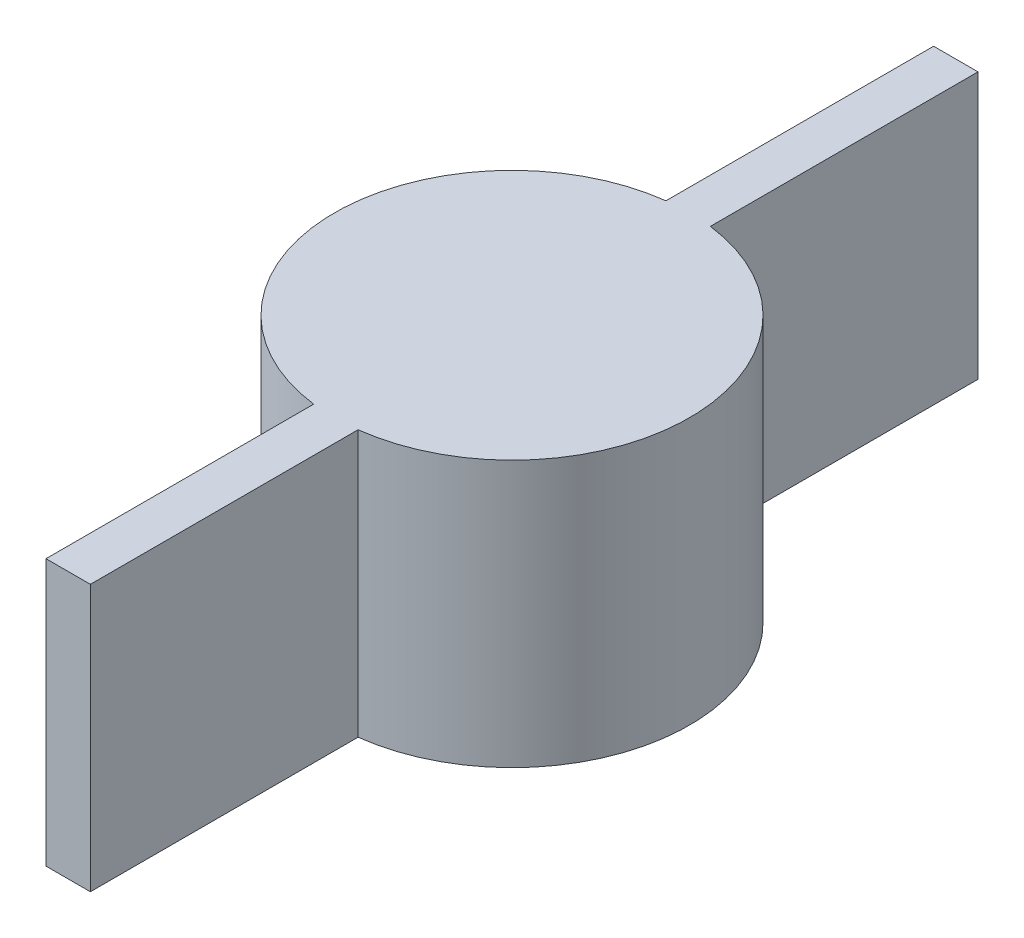
ISO-10303-21;
HEADER;
FILE_DESCRIPTION(('STEP AP214'),'2;1');
FILE_NAME('part.step','',(''),(''),'','','');
FILE_SCHEMA(('AUTOMOTIVE_DESIGN { 1 0 10303 214 1 1 1 1 }'));
ENDSEC;
DATA;
#1=APPLICATION_CONTEXT('core data for automotive mechanical design processes');
#2=APPLICATION_PROTOCOL_DEFINITION('international standard','automotive_design',2000,#1);
#3=PRODUCT_CONTEXT('',#1,'mechanical');
#4=PRODUCT('Part','Part','',(#3));
#5=PRODUCT_RELATED_PRODUCT_CATEGORY('part','',(#4));
#6=PRODUCT_DEFINITION_FORMATION('','',#4);
#7=PRODUCT_DEFINITION_CONTEXT('part definition',#1,'design');
#8=PRODUCT_DEFINITION('design','',#6,#7);
#9=PRODUCT_DEFINITION_SHAPE('','',#8);
#10=(LENGTH_UNIT() NAMED_UNIT(*) SI_UNIT(.MILLI.,.METRE.));
#11=(NAMED_UNIT(*) PLANE_ANGLE_UNIT() SI_UNIT($,.RADIAN.));
#12=(NAMED_UNIT(*) SI_UNIT($,.STERADIAN.) SOLID_ANGLE_UNIT());
#13=UNCERTAINTY_MEASURE_WITH_UNIT(LENGTH_MEASURE(1.E-05),#10,'distance_accuracy_value','');
#14=(GEOMETRIC_REPRESENTATION_CONTEXT(3) GLOBAL_UNCERTAINTY_ASSIGNED_CONTEXT((#13)) GLOBAL_UNIT_ASSIGNED_CONTEXT((#10,
#11,#12)) REPRESENTATION_CONTEXT('',''));
#15=CARTESIAN_POINT('',(0.,0.,0.));
#16=DIRECTION('',(0.,0.,1.));
#17=DIRECTION('',(1.,0.,0.));
#18=AXIS2_PLACEMENT_3D('',#15,#16,#17);
#19=CARTESIAN_POINT('',(0.,30.,0.));
#20=DIRECTION('',(0.,-1.,0.));
#21=DIRECTION('',(0.,0.,-1.));
#22=AXIS2_PLACEMENT_3D('',#19,#20,#21);
#23=CYLINDRICAL_SURFACE('',#22,20.);
#24=CARTESIAN_POINT('',(0.,0.,0.));
#25=DIRECTION('',(0.,1.,0.));
#26=DIRECTION('',(0.,0.,1.));
#27=AXIS2_PLACEMENT_3D('',#24,#25,#26);
#28=CIRCLE('',#27,20.);
#29=CARTESIAN_POINT('',(2.50000000000001,0.,19.8431348329844));
#30=VERTEX_POINT('',#29);
#31=CARTESIAN_POINT('',(2.5,0.,-19.8431348329844));
#32=VERTEX_POINT('',#31);
#33=EDGE_CURVE('E129',#30,#32,#28,.T.);
#34=ORIENTED_EDGE('',*,*,#33,.T.);
#35=DIRECTION('',(0.,-1.,0.));
#36=VECTOR('',#35,1.);
#37=CARTESIAN_POINT('',(2.5,30.,-19.8431348329844));
#38=LINE('',#37,#36);
#39=CARTESIAN_POINT('',(2.5,30.,-19.8431348329844));
#40=VERTEX_POINT('',#39);
#41=EDGE_CURVE('E11',#40,#32,#38,.T.);
#42=ORIENTED_EDGE('',*,*,#41,.F.);
#43=CARTESIAN_POINT('',(0.,30.,0.));
#44=DIRECTION('',(0.,1.,0.));
#45=DIRECTION('',(0.,0.,1.));
#46=AXIS2_PLACEMENT_3D('',#43,#44,#45);
#47=CIRCLE('',#46,20.);
#48=CARTESIAN_POINT('',(2.50000000000001,30.,19.8431348329844));
#49=VERTEX_POINT('',#48);
#50=EDGE_CURVE('E143',#49,#40,#47,.T.);
#51=ORIENTED_EDGE('',*,*,#50,.F.);
#52=DIRECTION('',(0.,-1.,0.));
#53=VECTOR('',#52,1.);
#54=CARTESIAN_POINT('',(2.50000000000001,30.,19.8431348329844));
#55=LINE('',#54,#53);
#56=EDGE_CURVE('E125',#49,#30,#55,.T.);
#57=ORIENTED_EDGE('',*,*,#56,.T.);
#58=EDGE_LOOP('',(#34,#42,#51,#57));
#59=FACE_BOUND('',#58,.T.);
#60=ADVANCED_FACE('F33',(#59),#23,.T.);
#61=CARTESIAN_POINT('',(2.5,30.,-19.8431348329844));
#62=DIRECTION('',(-1.,0.,0.));
#63=DIRECTION('',(0.,0.,1.));
#64=AXIS2_PLACEMENT_3D('',#61,#62,#63);
#65=PLANE('',#64);
#66=DIRECTION('',(0.,0.,-1.));
#67=VECTOR('',#66,1.);
#68=CARTESIAN_POINT('',(2.5,0.,-19.8431348329844));
#69=LINE('',#68,#67);
#70=CARTESIAN_POINT('',(2.49999999999999,0.,-50.));
#71=VERTEX_POINT('',#70);
#72=EDGE_CURVE('E132',#32,#71,#69,.T.);
#73=ORIENTED_EDGE('',*,*,#72,.T.);
#74=DIRECTION('',(0.,-1.,0.));
#75=VECTOR('',#74,1.);
#76=CARTESIAN_POINT('',(2.49999999999999,30.,-50.));
#77=LINE('',#76,#75);
#78=CARTESIAN_POINT('',(2.49999999999999,30.,-50.));
#79=VERTEX_POINT('',#78);
#80=EDGE_CURVE('E41',#79,#71,#77,.T.);
#81=ORIENTED_EDGE('',*,*,#80,.F.);
#82=DIRECTION('',(0.,0.,-1.));
#83=VECTOR('',#82,1.);
#84=CARTESIAN_POINT('',(2.5,30.,-19.8431348329844));
#85=LINE('',#84,#83);
#86=EDGE_CURVE('E92',#40,#79,#85,.T.);
#87=ORIENTED_EDGE('',*,*,#86,.F.);
#88=ORIENTED_EDGE('',*,*,#41,.T.);
#89=EDGE_LOOP('',(#73,#81,#87,#88));
#90=FACE_BOUND('',#89,.T.);
#91=ADVANCED_FACE('F178',(#90),#65,.F.);
#92=CARTESIAN_POINT('',(2.49999999999999,30.,-50.));
#93=DIRECTION('',(0.,0.,1.));
#94=DIRECTION('',(1.,0.,0.));
#95=AXIS2_PLACEMENT_3D('',#92,#93,#94);
#96=PLANE('',#95);
#97=DIRECTION('',(-1.,0.,0.));
#98=VECTOR('',#97,1.);
#99=CARTESIAN_POINT('',(2.49999999999999,0.,-50.));
#100=LINE('',#99,#98);
#101=CARTESIAN_POINT('',(-2.50000000000001,0.,-50.));
#102=VERTEX_POINT('',#101);
#103=EDGE_CURVE('E134',#71,#102,#100,.T.);
#104=ORIENTED_EDGE('',*,*,#103,.T.);
#105=DIRECTION('',(0.,-1.,0.));
#106=VECTOR('',#105,1.);
#107=CARTESIAN_POINT('',(-2.50000000000001,30.,-50.));
#108=LINE('',#107,#106);
#109=CARTESIAN_POINT('',(-2.50000000000001,30.,-50.));
#110=VERTEX_POINT('',#109);
#111=EDGE_CURVE('E150',#110,#102,#108,.T.);
#112=ORIENTED_EDGE('',*,*,#111,.F.);
#113=DIRECTION('',(-1.,0.,0.));
#114=VECTOR('',#113,1.);
#115=CARTESIAN_POINT('',(2.49999999999999,30.,-50.));
#116=LINE('',#115,#114);
#117=EDGE_CURVE('E158',#79,#110,#116,.T.);
#118=ORIENTED_EDGE('',*,*,#117,.F.);
#119=ORIENTED_EDGE('',*,*,#80,.T.);
#120=EDGE_LOOP('',(#104,#112,#118,#119));
#121=FACE_BOUND('',#120,.T.);
#122=ADVANCED_FACE('F156',(#121),#96,.F.);
#123=CARTESIAN_POINT('',(-2.50000000000001,30.,-50.));
#124=DIRECTION('',(1.,0.,0.));
#125=DIRECTION('',(0.,0.,-1.));
#126=AXIS2_PLACEMENT_3D('',#123,#124,#125);
#127=PLANE('',#126);
#128=DIRECTION('',(0.,0.,1.));
#129=VECTOR('',#128,1.);
#130=CARTESIAN_POINT('',(-2.50000000000001,0.,-50.));
#131=LINE('',#130,#129);
#132=CARTESIAN_POINT('',(-2.49999999999999,0.,-19.8431348329844));
#133=VERTEX_POINT('',#132);
#134=EDGE_CURVE('E136',#102,#133,#131,.T.);
#135=ORIENTED_EDGE('',*,*,#134,.T.);
#136=DIRECTION('',(0.,-1.,0.));
#137=VECTOR('',#136,1.);
#138=CARTESIAN_POINT('',(-2.49999999999999,30.,-19.8431348329844));
#139=LINE('',#138,#137);
#140=CARTESIAN_POINT('',(-2.49999999999999,30.,-19.8431348329844));
#141=VERTEX_POINT('',#140);
#142=EDGE_CURVE('E147',#141,#133,#139,.T.);
#143=ORIENTED_EDGE('',*,*,#142,.F.);
#144=DIRECTION('',(0.,0.,1.));
#145=VECTOR('',#144,1.);
#146=CARTESIAN_POINT('',(-2.50000000000001,30.,-50.));
#147=LINE('',#146,#145);
#148=EDGE_CURVE('E170',#110,#141,#147,.T.);
#149=ORIENTED_EDGE('',*,*,#148,.F.);
#150=ORIENTED_EDGE('',*,*,#111,.T.);
#151=EDGE_LOOP('',(#135,#143,#149,#150));
#152=FACE_BOUND('',#151,.T.);
#153=ADVANCED_FACE('F166',(#152),#127,.F.);
#154=CARTESIAN_POINT('',(0.,30.,0.));
#155=DIRECTION('',(0.,-1.,0.));
#156=DIRECTION('',(0.,0.,-1.));
#157=AXIS2_PLACEMENT_3D('',#154,#155,#156);
#158=CYLINDRICAL_SURFACE('',#157,20.);
#159=CARTESIAN_POINT('',(0.,0.,0.));
#160=DIRECTION('',(0.,1.,0.));
#161=DIRECTION('',(0.,0.,1.));
#162=AXIS2_PLACEMENT_3D('',#159,#160,#161);
#163=CIRCLE('',#162,20.);
#164=CARTESIAN_POINT('',(-2.49999999999999,0.,19.8431348329844));
#165=VERTEX_POINT('',#164);
#166=EDGE_CURVE('E138',#133,#165,#163,.T.);
#167=ORIENTED_EDGE('',*,*,#166,.T.);
#168=DIRECTION('',(0.,-1.,0.));
#169=VECTOR('',#168,1.);
#170=CARTESIAN_POINT('',(-2.49999999999999,30.,19.8431348329844));
#171=LINE('',#170,#169);
#172=CARTESIAN_POINT('',(-2.49999999999999,30.,19.8431348329844));
#173=VERTEX_POINT('',#172);
#174=EDGE_CURVE('E120',#173,#165,#171,.T.);
#175=ORIENTED_EDGE('',*,*,#174,.F.);
#176=CARTESIAN_POINT('',(0.,30.,0.));
#177=DIRECTION('',(0.,1.,0.));
#178=DIRECTION('',(0.,0.,1.));
#179=AXIS2_PLACEMENT_3D('',#176,#177,#178);
#180=CIRCLE('',#179,20.);
#181=EDGE_CURVE('E111',#141,#173,#180,.T.);
#182=ORIENTED_EDGE('',*,*,#181,.F.);
#183=ORIENTED_EDGE('',*,*,#142,.T.);
#184=EDGE_LOOP('',(#167,#175,#182,#183));
#185=FACE_BOUND('',#184,.T.);
#186=ADVANCED_FACE('F169',(#185),#158,.T.);
#187=CARTESIAN_POINT('',(-2.49999999999999,30.,19.8431348329844));
#188=DIRECTION('',(1.,0.,0.));
#189=DIRECTION('',(0.,0.,-1.));
#190=AXIS2_PLACEMENT_3D('',#187,#188,#189);
#191=PLANE('',#190);
#192=DIRECTION('',(0.,0.,1.));
#193=VECTOR('',#192,1.);
#194=CARTESIAN_POINT('',(-2.49999999999999,0.,19.8431348329844));
#195=LINE('',#194,#193);
#196=CARTESIAN_POINT('',(-2.50000000000001,0.,50.));
#197=VERTEX_POINT('',#196);
#198=EDGE_CURVE('E119',#165,#197,#195,.T.);
#199=ORIENTED_EDGE('',*,*,#198,.T.);
#200=DIRECTION('',(0.,-1.,0.));
#201=VECTOR('',#200,1.);
#202=CARTESIAN_POINT('',(-2.50000000000001,30.,50.));
#203=LINE('',#202,#201);
#204=CARTESIAN_POINT('',(-2.50000000000001,30.,50.));
#205=VERTEX_POINT('',#204);
#206=EDGE_CURVE('E116',#205,#197,#203,.T.);
#207=ORIENTED_EDGE('',*,*,#206,.F.);
#208=DIRECTION('',(0.,0.,1.));
#209=VECTOR('',#208,1.);
#210=CARTESIAN_POINT('',(-2.49999999999999,30.,19.8431348329844));
#211=LINE('',#210,#209);
#212=EDGE_CURVE('E105',#173,#205,#211,.T.);
#213=ORIENTED_EDGE('',*,*,#212,.F.);
#214=ORIENTED_EDGE('',*,*,#174,.T.);
#215=EDGE_LOOP('',(#199,#207,#213,#214));
#216=FACE_BOUND('',#215,.T.);
#217=ADVANCED_FACE('F117',(#216),#191,.F.);
#218=CARTESIAN_POINT('',(-2.50000000000001,30.,50.));
#219=DIRECTION('',(0.,0.,-1.));
#220=DIRECTION('',(-1.,0.,0.));
#221=AXIS2_PLACEMENT_3D('',#218,#219,#220);
#222=PLANE('',#221);
#223=DIRECTION('',(1.,0.,0.));
#224=VECTOR('',#223,1.);
#225=CARTESIAN_POINT('',(-2.50000000000001,0.,50.));
#226=LINE('',#225,#224);
#227=CARTESIAN_POINT('',(2.50000000000004,0.,50.));
#228=VERTEX_POINT('',#227);
#229=EDGE_CURVE('E78',#197,#228,#226,.T.);
#230=ORIENTED_EDGE('',*,*,#229,.T.);
#231=DIRECTION('',(0.,-1.,0.));
#232=VECTOR('',#231,1.);
#233=CARTESIAN_POINT('',(2.50000000000004,30.,50.));
#234=LINE('',#233,#232);
#235=CARTESIAN_POINT('',(2.50000000000004,30.,50.));
#236=VERTEX_POINT('',#235);
#237=EDGE_CURVE('E121',#236,#228,#234,.T.);
#238=ORIENTED_EDGE('',*,*,#237,.F.);
#239=DIRECTION('',(1.,0.,0.));
#240=VECTOR('',#239,1.);
#241=CARTESIAN_POINT('',(-2.50000000000001,30.,50.));
#242=LINE('',#241,#240);
#243=EDGE_CURVE('E109',#205,#236,#242,.T.);
#244=ORIENTED_EDGE('',*,*,#243,.F.);
#245=ORIENTED_EDGE('',*,*,#206,.T.);
#246=EDGE_LOOP('',(#230,#238,#244,#245));
#247=FACE_BOUND('',#246,.T.);
#248=ADVANCED_FACE('F123',(#247),#222,.F.);
#249=CARTESIAN_POINT('',(2.50000000000004,30.,50.));
#250=DIRECTION('',(-1.,0.,0.));
#251=DIRECTION('',(0.,0.,1.));
#252=AXIS2_PLACEMENT_3D('',#249,#250,#251);
#253=PLANE('',#252);
#254=DIRECTION('',(0.,0.,-1.));
#255=VECTOR('',#254,1.);
#256=CARTESIAN_POINT('',(2.50000000000004,0.,50.));
#257=LINE('',#256,#255);
#258=EDGE_CURVE('E84',#228,#30,#257,.T.);
#259=ORIENTED_EDGE('',*,*,#258,.T.);
#260=ORIENTED_EDGE('',*,*,#56,.F.);
#261=DIRECTION('',(0.,0.,-1.));
#262=VECTOR('',#261,1.);
#263=CARTESIAN_POINT('',(2.50000000000004,30.,50.));
#264=LINE('',#263,#262);
#265=EDGE_CURVE('E49',#236,#49,#264,.T.);
#266=ORIENTED_EDGE('',*,*,#265,.F.);
#267=ORIENTED_EDGE('',*,*,#237,.T.);
#268=EDGE_LOOP('',(#259,#260,#266,#267));
#269=FACE_BOUND('',#268,.T.);
#270=ADVANCED_FACE('F194',(#269),#253,.F.);
#271=CARTESIAN_POINT('',(0.,30.,0.));
#272=DIRECTION('',(0.,1.,0.));
#273=DIRECTION('',(0.,0.,1.));
#274=AXIS2_PLACEMENT_3D('',#271,#272,#273);
#275=PLANE('',#274);
#276=ORIENTED_EDGE('',*,*,#50,.T.);
#277=ORIENTED_EDGE('',*,*,#86,.T.);
#278=ORIENTED_EDGE('',*,*,#117,.T.);
#279=ORIENTED_EDGE('',*,*,#148,.T.);
#280=ORIENTED_EDGE('',*,*,#181,.T.);
#281=ORIENTED_EDGE('',*,*,#212,.T.);
#282=ORIENTED_EDGE('',*,*,#243,.T.);
#283=ORIENTED_EDGE('',*,*,#265,.T.);
#284=EDGE_LOOP('',(#276,#277,#278,#279,#280,#281,#282,#283));
#285=FACE_BOUND('',#284,.T.);
#286=ADVANCED_FACE('F107',(#285),#275,.T.);
#287=CARTESIAN_POINT('',(0.,0.,0.));
#288=DIRECTION('',(0.,1.,0.));
#289=DIRECTION('',(0.,0.,1.));
#290=AXIS2_PLACEMENT_3D('',#287,#288,#289);
#291=PLANE('',#290);
#292=ORIENTED_EDGE('',*,*,#33,.F.);
#293=ORIENTED_EDGE('',*,*,#258,.F.);
#294=ORIENTED_EDGE('',*,*,#229,.F.);
#295=ORIENTED_EDGE('',*,*,#198,.F.);
#296=ORIENTED_EDGE('',*,*,#166,.F.);
#297=ORIENTED_EDGE('',*,*,#134,.F.);
#298=ORIENTED_EDGE('',*,*,#103,.F.);
#299=ORIENTED_EDGE('',*,*,#72,.F.);
#300=EDGE_LOOP('',(#292,#293,#294,#295,#296,#297,#298,#299));
#301=FACE_BOUND('',#300,.T.);
#302=ADVANCED_FACE('F162',(#301),#291,.F.);
#303=CLOSED_SHELL('',(#60,#91,#122,#153,#186,#217,#248,#270,#286,#302));
#304=MANIFOLD_SOLID_BREP('B2',#303);
#305=ADVANCED_BREP_SHAPE_REPRESENTATION('',(#18,#304),#14);
#306=SHAPE_DEFINITION_REPRESENTATION(#9,#305);
ENDSEC;
END-ISO-10303-21;
